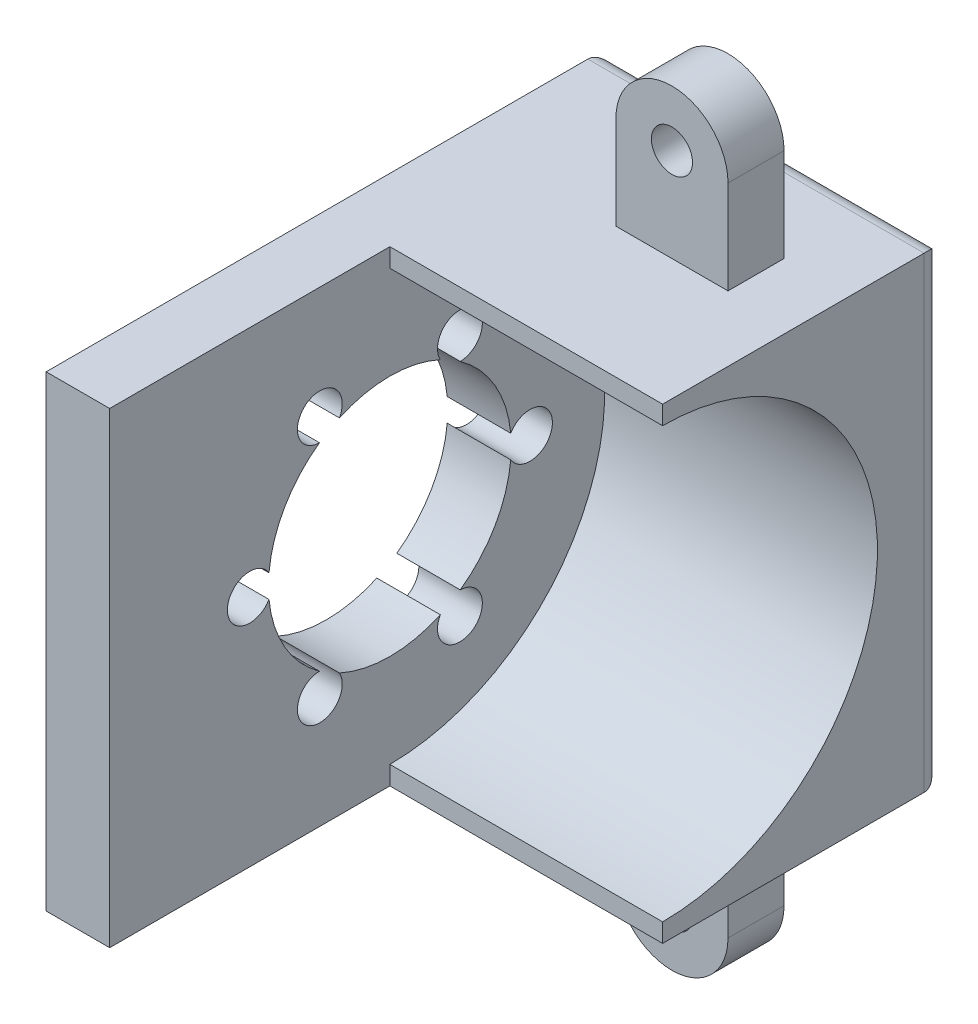
ISO-10303-21;
HEADER;
FILE_DESCRIPTION(('STEP AP214'),'2;1');
FILE_NAME('part.step','',(''),(''),'','','');
FILE_SCHEMA(('AUTOMOTIVE_DESIGN { 1 0 10303 214 1 1 1 1 }'));
ENDSEC;
DATA;
#1=APPLICATION_CONTEXT('core data for automotive mechanical design processes');
#2=APPLICATION_PROTOCOL_DEFINITION('international standard','automotive_design',2000,#1);
#3=PRODUCT_CONTEXT('',#1,'mechanical');
#4=PRODUCT('Part','Part','',(#3));
#5=PRODUCT_RELATED_PRODUCT_CATEGORY('part','',(#4));
#6=PRODUCT_DEFINITION_FORMATION('','',#4);
#7=PRODUCT_DEFINITION_CONTEXT('part definition',#1,'design');
#8=PRODUCT_DEFINITION('design','',#6,#7);
#9=PRODUCT_DEFINITION_SHAPE('','',#8);
#10=(LENGTH_UNIT() NAMED_UNIT(*) SI_UNIT(.MILLI.,.METRE.));
#11=(NAMED_UNIT(*) PLANE_ANGLE_UNIT() SI_UNIT($,.RADIAN.));
#12=(NAMED_UNIT(*) SI_UNIT($,.STERADIAN.) SOLID_ANGLE_UNIT());
#13=UNCERTAINTY_MEASURE_WITH_UNIT(LENGTH_MEASURE(1.E-05),#10,'distance_accuracy_value','');
#14=(GEOMETRIC_REPRESENTATION_CONTEXT(3) GLOBAL_UNCERTAINTY_ASSIGNED_CONTEXT((#13)) GLOBAL_UNIT_ASSIGNED_CONTEXT((#10,
#11,#12)) REPRESENTATION_CONTEXT('',''));
#15=CARTESIAN_POINT('',(0.,0.,0.));
#16=DIRECTION('',(0.,0.,1.));
#17=DIRECTION('',(1.,0.,0.));
#18=AXIS2_PLACEMENT_3D('',#15,#16,#17);
#19=CARTESIAN_POINT('',(-3.,-17.5,-7.));
#20=DIRECTION('',(-1.,0.,0.));
#21=DIRECTION('',(0.,-1.,0.));
#22=AXIS2_PLACEMENT_3D('',#19,#20,#21);
#23=PLANE('',#22);
#24=DIRECTION('',(0.,0.,-1.));
#25=VECTOR('',#24,1.);
#26=CARTESIAN_POINT('',(-3.,-12.5,-7.));
#27=LINE('',#26,#25);
#28=CARTESIAN_POINT('',(-3.,-12.5,-7.));
#29=VERTEX_POINT('',#28);
#30=CARTESIAN_POINT('',(-3.,-12.5,-10.));
#31=VERTEX_POINT('',#30);
#32=EDGE_CURVE('E540',#29,#31,#27,.T.);
#33=ORIENTED_EDGE('',*,*,#32,.T.);
#34=DIRECTION('',(0.,1.,0.));
#35=VECTOR('',#34,1.);
#36=CARTESIAN_POINT('',(-3.,-17.5,-10.));
#37=LINE('',#36,#35);
#38=CARTESIAN_POINT('',(-3.,-17.5,-10.));
#39=VERTEX_POINT('',#38);
#40=EDGE_CURVE('E518',#39,#31,#37,.T.);
#41=ORIENTED_EDGE('',*,*,#40,.F.);
#42=DIRECTION('',(0.,0.,-1.));
#43=VECTOR('',#42,1.);
#44=CARTESIAN_POINT('',(-3.,-17.5,-7.));
#45=LINE('',#44,#43);
#46=CARTESIAN_POINT('',(-3.,-17.5,-7.));
#47=VERTEX_POINT('',#46);
#48=EDGE_CURVE('E541',#47,#39,#45,.T.);
#49=ORIENTED_EDGE('',*,*,#48,.F.);
#50=DIRECTION('',(0.,1.,0.));
#51=VECTOR('',#50,1.);
#52=CARTESIAN_POINT('',(-3.,-17.5,-7.));
#53=LINE('',#52,#51);
#54=EDGE_CURVE('E528',#47,#29,#53,.T.);
#55=ORIENTED_EDGE('',*,*,#54,.T.);
#56=EDGE_LOOP('',(#33,#41,#49,#55));
#57=FACE_BOUND('',#56,.T.);
#58=ADVANCED_FACE('F93',(#57),#23,.T.);
#59=CARTESIAN_POINT('',(0.,-17.5,-7.));
#60=DIRECTION('',(0.,0.,-1.));
#61=DIRECTION('',(-1.,0.,0.));
#62=AXIS2_PLACEMENT_3D('',#59,#60,#61);
#63=CYLINDRICAL_SURFACE('',#62,3.);
#64=ORIENTED_EDGE('',*,*,#48,.T.);
#65=CARTESIAN_POINT('',(0.,-17.5,-10.));
#66=DIRECTION('',(0.,0.,-1.));
#67=DIRECTION('',(-1.,0.,0.));
#68=AXIS2_PLACEMENT_3D('',#65,#66,#67);
#69=CIRCLE('',#68,3.);
#70=CARTESIAN_POINT('',(3.,-17.5,-10.));
#71=VERTEX_POINT('',#70);
#72=EDGE_CURVE('E506',#71,#39,#69,.T.);
#73=ORIENTED_EDGE('',*,*,#72,.F.);
#74=DIRECTION('',(0.,0.,-1.));
#75=VECTOR('',#74,1.);
#76=CARTESIAN_POINT('',(3.,-17.5,-7.));
#77=LINE('',#76,#75);
#78=CARTESIAN_POINT('',(3.,-17.5,-7.));
#79=VERTEX_POINT('',#78);
#80=EDGE_CURVE('E545',#79,#71,#77,.T.);
#81=ORIENTED_EDGE('',*,*,#80,.F.);
#82=CARTESIAN_POINT('',(0.,-17.5,-7.));
#83=DIRECTION('',(0.,0.,-1.));
#84=DIRECTION('',(-1.,0.,0.));
#85=AXIS2_PLACEMENT_3D('',#82,#83,#84);
#86=CIRCLE('',#85,3.);
#87=EDGE_CURVE('E537',#79,#47,#86,.T.);
#88=ORIENTED_EDGE('',*,*,#87,.T.);
#89=EDGE_LOOP('',(#64,#73,#81,#88));
#90=FACE_BOUND('',#89,.T.);
#91=ADVANCED_FACE('F380',(#90),#63,.T.);
#92=CARTESIAN_POINT('',(3.,-17.5,-7.));
#93=DIRECTION('',(1.,0.,0.));
#94=DIRECTION('',(0.,0.,-1.));
#95=AXIS2_PLACEMENT_3D('',#92,#93,#94);
#96=PLANE('',#95);
#97=ORIENTED_EDGE('',*,*,#80,.T.);
#98=DIRECTION('',(0.,-1.,0.));
#99=VECTOR('',#98,1.);
#100=CARTESIAN_POINT('',(3.,-17.5,-10.));
#101=LINE('',#100,#99);
#102=CARTESIAN_POINT('',(3.,-12.5,-10.));
#103=VERTEX_POINT('',#102);
#104=EDGE_CURVE('E523',#103,#71,#101,.T.);
#105=ORIENTED_EDGE('',*,*,#104,.F.);
#106=DIRECTION('',(0.,0.,-1.));
#107=VECTOR('',#106,1.);
#108=CARTESIAN_POINT('',(3.,-12.5,-7.));
#109=LINE('',#108,#107);
#110=CARTESIAN_POINT('',(3.,-12.5,-7.));
#111=VERTEX_POINT('',#110);
#112=EDGE_CURVE('E548',#111,#103,#109,.T.);
#113=ORIENTED_EDGE('',*,*,#112,.F.);
#114=DIRECTION('',(0.,-1.,0.));
#115=VECTOR('',#114,1.);
#116=CARTESIAN_POINT('',(3.,-17.5,-7.));
#117=LINE('',#116,#115);
#118=EDGE_CURVE('E534',#111,#79,#117,.T.);
#119=ORIENTED_EDGE('',*,*,#118,.T.);
#120=EDGE_LOOP('',(#97,#105,#113,#119));
#121=FACE_BOUND('',#120,.T.);
#122=ADVANCED_FACE('F386',(#121),#96,.T.);
#123=CARTESIAN_POINT('',(0.,-17.5,-7.));
#124=DIRECTION('',(0.,0.,-1.));
#125=DIRECTION('',(-1.,0.,0.));
#126=AXIS2_PLACEMENT_3D('',#123,#124,#125);
#127=CYLINDRICAL_SURFACE('',#126,1.1);
#128=CARTESIAN_POINT('',(0.,-17.5,-7.));
#129=DIRECTION('',(0.,0.,-1.));
#130=DIRECTION('',(-1.,0.,0.));
#131=AXIS2_PLACEMENT_3D('',#128,#129,#130);
#132=CIRCLE('',#131,1.1);
#133=CARTESIAN_POINT('',(-1.1,-17.5,-7.));
#134=VERTEX_POINT('',#133);
#135=EDGE_CURVE('E515',#134,#134,#132,.T.);
#136=ORIENTED_EDGE('',*,*,#135,.F.);
#137=EDGE_LOOP('',(#136));
#138=FACE_BOUND('',#137,.T.);
#139=CARTESIAN_POINT('',(0.,-17.5,-10.));
#140=DIRECTION('',(0.,0.,-1.));
#141=DIRECTION('',(-1.,0.,0.));
#142=AXIS2_PLACEMENT_3D('',#139,#140,#141);
#143=CIRCLE('',#142,1.1);
#144=CARTESIAN_POINT('',(-1.1,-17.5,-10.));
#145=VERTEX_POINT('',#144);
#146=EDGE_CURVE('E359',#145,#145,#143,.T.);
#147=ORIENTED_EDGE('',*,*,#146,.T.);
#148=EDGE_LOOP('',(#147));
#149=FACE_BOUND('',#148,.T.);
#150=ADVANCED_FACE('F752',(#138,#149),#127,.F.);
#151=CARTESIAN_POINT('',(0.,12.5,-15.));
#152=DIRECTION('',(0.,-1.,0.));
#153=DIRECTION('',(0.,0.,-1.));
#154=AXIS2_PLACEMENT_3D('',#151,#152,#153);
#155=PLANE('',#154);
#156=DIRECTION('',(0.,0.,-1.));
#157=VECTOR('',#156,1.);
#158=CARTESIAN_POINT('',(6.5,12.5,-15.));
#159=LINE('',#158,#157);
#160=CARTESIAN_POINT('',(6.5,12.5,0.));
#161=VERTEX_POINT('',#160);
#162=CARTESIAN_POINT('',(6.5,12.5,-14.));
#163=VERTEX_POINT('',#162);
#164=EDGE_CURVE('E360',#161,#163,#159,.T.);
#165=ORIENTED_EDGE('',*,*,#164,.T.);
#166=DIRECTION('',(1.,0.,0.));
#167=VECTOR('',#166,1.);
#168=CARTESIAN_POINT('',(0.,12.5,-14.));
#169=LINE('',#168,#167);
#170=CARTESIAN_POINT('',(-11.5,12.5,-14.));
#171=VERTEX_POINT('',#170);
#172=EDGE_CURVE('E12',#163,#171,#169,.F.);
#173=ORIENTED_EDGE('',*,*,#172,.T.);
#174=DIRECTION('',(0.,0.,1.));
#175=VECTOR('',#174,1.);
#176=CARTESIAN_POINT('',(-11.5,12.5,-15.));
#177=LINE('',#176,#175);
#178=CARTESIAN_POINT('',(-11.5,12.5,15.));
#179=VERTEX_POINT('',#178);
#180=EDGE_CURVE('E485',#171,#179,#177,.T.);
#181=ORIENTED_EDGE('',*,*,#180,.T.);
#182=DIRECTION('',(-1.,0.,0.));
#183=VECTOR('',#182,1.);
#184=CARTESIAN_POINT('',(-11.5,12.5,15.));
#185=LINE('',#184,#183);
#186=CARTESIAN_POINT('',(-8.10000000000001,12.5,15.));
#187=VERTEX_POINT('',#186);
#188=EDGE_CURVE('E473',#187,#179,#185,.T.);
#189=ORIENTED_EDGE('',*,*,#188,.F.);
#190=DIRECTION('',(0.,0.,-1.));
#191=VECTOR('',#190,1.);
#192=CARTESIAN_POINT('',(-8.10000000000001,12.5,15.));
#193=LINE('',#192,#191);
#194=CARTESIAN_POINT('',(-8.1,12.5,0.));
#195=VERTEX_POINT('',#194);
#196=EDGE_CURVE('E480',#187,#195,#193,.T.);
#197=ORIENTED_EDGE('',*,*,#196,.T.);
#198=DIRECTION('',(1.,0.,0.));
#199=VECTOR('',#198,1.);
#200=CARTESIAN_POINT('',(0.,12.5,0.));
#201=LINE('',#200,#199);
#202=EDGE_CURVE('E465',#195,#161,#201,.T.);
#203=ORIENTED_EDGE('',*,*,#202,.T.);
#204=EDGE_LOOP('',(#165,#173,#181,#189,#197,#203));
#205=FACE_BOUND('',#204,.T.);
#206=DIRECTION('',(0.,0.,-1.));
#207=VECTOR('',#206,1.);
#208=CARTESIAN_POINT('',(3.,12.5,-7.));
#209=LINE('',#208,#207);
#210=CARTESIAN_POINT('',(3.,12.5,-7.));
#211=VERTEX_POINT('',#210);
#212=CARTESIAN_POINT('',(3.,12.5,-10.));
#213=VERTEX_POINT('',#212);
#214=EDGE_CURVE('E574',#211,#213,#209,.T.);
#215=ORIENTED_EDGE('',*,*,#214,.F.);
#216=DIRECTION('',(-1.,0.,0.));
#217=VECTOR('',#216,1.);
#218=CARTESIAN_POINT('',(3.,12.5,-7.));
#219=LINE('',#218,#217);
#220=CARTESIAN_POINT('',(-3.,12.5,-7.));
#221=VERTEX_POINT('',#220);
#222=EDGE_CURVE('E560',#211,#221,#219,.T.);
#223=ORIENTED_EDGE('',*,*,#222,.T.);
#224=DIRECTION('',(0.,0.,-1.));
#225=VECTOR('',#224,1.);
#226=CARTESIAN_POINT('',(-3.,12.5,-7.));
#227=LINE('',#226,#225);
#228=CARTESIAN_POINT('',(-3.,12.5,-10.));
#229=VERTEX_POINT('',#228);
#230=EDGE_CURVE('E571',#221,#229,#227,.T.);
#231=ORIENTED_EDGE('',*,*,#230,.T.);
#232=DIRECTION('',(-1.,0.,0.));
#233=VECTOR('',#232,1.);
#234=CARTESIAN_POINT('',(3.,12.5,-10.));
#235=LINE('',#234,#233);
#236=EDGE_CURVE('E511',#213,#229,#235,.T.);
#237=ORIENTED_EDGE('',*,*,#236,.F.);
#238=EDGE_LOOP('',(#215,#223,#231,#237));
#239=FACE_BOUND('',#238,.T.);
#240=ADVANCED_FACE('F488',(#205,#239),#155,.F.);
#241=CARTESIAN_POINT('',(0.,0.,0.));
#242=DIRECTION('',(0.,0.,1.));
#243=DIRECTION('',(1.,0.,0.));
#244=AXIS2_PLACEMENT_3D('',#241,#242,#243);
#245=PLANE('',#244);
#246=DIRECTION('',(0.,-1.,0.));
#247=VECTOR('',#246,1.);
#248=CARTESIAN_POINT('',(6.5,0.,0.));
#249=LINE('',#248,#247);
#250=CARTESIAN_POINT('',(6.5,11.5,0.));
#251=VERTEX_POINT('',#250);
#252=EDGE_CURVE('E296',#161,#251,#249,.T.);
#253=ORIENTED_EDGE('',*,*,#252,.F.);
#254=ORIENTED_EDGE('',*,*,#202,.F.);
#255=DIRECTION('',(0.,1.,0.));
#256=VECTOR('',#255,1.);
#257=CARTESIAN_POINT('',(-8.10000000000001,12.5,0.));
#258=LINE('',#257,#256);
#259=CARTESIAN_POINT('',(-8.10000000000001,11.5,0.));
#260=VERTEX_POINT('',#259);
#261=EDGE_CURVE('E461',#260,#195,#258,.T.);
#262=ORIENTED_EDGE('',*,*,#261,.F.);
#263=DIRECTION('',(1.,0.,0.));
#264=VECTOR('',#263,1.);
#265=CARTESIAN_POINT('',(11.5,11.5,0.));
#266=LINE('',#265,#264);
#267=EDGE_CURVE('E314',#260,#251,#266,.T.);
#268=ORIENTED_EDGE('',*,*,#267,.T.);
#269=EDGE_LOOP('',(#253,#254,#262,#268));
#270=FACE_BOUND('',#269,.T.);
#271=ADVANCED_FACE('F469',(#270),#245,.T.);
#272=DIRECTION('',(0.,-1.,0.));
#273=VECTOR('',#272,1.);
#274=CARTESIAN_POINT('',(6.5,0.,0.));
#275=LINE('',#274,#273);
#276=CARTESIAN_POINT('',(6.5,-11.5,0.));
#277=VERTEX_POINT('',#276);
#278=CARTESIAN_POINT('',(6.5,-12.5,0.));
#279=VERTEX_POINT('',#278);
#280=EDGE_CURVE('E293',#277,#279,#275,.T.);
#281=ORIENTED_EDGE('',*,*,#280,.F.);
#282=DIRECTION('',(1.,0.,0.));
#283=VECTOR('',#282,1.);
#284=CARTESIAN_POINT('',(11.5,-11.5,0.));
#285=LINE('',#284,#283);
#286=CARTESIAN_POINT('',(-8.1,-11.5,0.));
#287=VERTEX_POINT('',#286);
#288=EDGE_CURVE('E301',#277,#287,#285,.F.);
#289=ORIENTED_EDGE('',*,*,#288,.T.);
#290=CARTESIAN_POINT('',(-8.1,-12.5,0.));
#291=VERTEX_POINT('',#290);
#292=EDGE_CURVE('E464',#291,#287,#258,.T.);
#293=ORIENTED_EDGE('',*,*,#292,.F.);
#294=DIRECTION('',(1.,0.,0.));
#295=VECTOR('',#294,1.);
#296=CARTESIAN_POINT('',(0.,-12.5,0.));
#297=LINE('',#296,#295);
#298=EDGE_CURVE('E308',#291,#279,#297,.T.);
#299=ORIENTED_EDGE('',*,*,#298,.T.);
#300=EDGE_LOOP('',(#281,#289,#293,#299));
#301=FACE_BOUND('',#300,.T.);
#302=ADVANCED_FACE('F305',(#301),#245,.T.);
#303=CARTESIAN_POINT('',(0.,-12.5,-15.));
#304=DIRECTION('',(0.,-1.,0.));
#305=DIRECTION('',(0.,0.,-1.));
#306=AXIS2_PLACEMENT_3D('',#303,#304,#305);
#307=PLANE('',#306);
#308=DIRECTION('',(0.,0.,1.));
#309=VECTOR('',#308,1.);
#310=CARTESIAN_POINT('',(-11.5,-12.5,-15.));
#311=LINE('',#310,#309);
#312=CARTESIAN_POINT('',(-11.5,-12.5,-14.));
#313=VERTEX_POINT('',#312);
#314=CARTESIAN_POINT('',(-11.5,-12.5,15.));
#315=VERTEX_POINT('',#314);
#316=EDGE_CURVE('E316',#313,#315,#311,.T.);
#317=ORIENTED_EDGE('',*,*,#316,.F.);
#318=DIRECTION('',(1.,0.,0.));
#319=VECTOR('',#318,1.);
#320=CARTESIAN_POINT('',(6.5,-12.5,-14.));
#321=LINE('',#320,#319);
#322=CARTESIAN_POINT('',(6.5,-12.5,-14.));
#323=VERTEX_POINT('',#322);
#324=EDGE_CURVE('E331',#313,#323,#321,.T.);
#325=ORIENTED_EDGE('',*,*,#324,.T.);
#326=DIRECTION('',(0.,0.,-1.));
#327=VECTOR('',#326,1.);
#328=CARTESIAN_POINT('',(6.5,-12.5,-15.));
#329=LINE('',#328,#327);
#330=EDGE_CURVE('E356',#279,#323,#329,.T.);
#331=ORIENTED_EDGE('',*,*,#330,.F.);
#332=ORIENTED_EDGE('',*,*,#298,.F.);
#333=DIRECTION('',(0.,0.,-1.));
#334=VECTOR('',#333,1.);
#335=CARTESIAN_POINT('',(-8.1,-12.5,15.));
#336=LINE('',#335,#334);
#337=CARTESIAN_POINT('',(-8.1,-12.5,15.));
#338=VERTEX_POINT('',#337);
#339=EDGE_CURVE('E466',#338,#291,#336,.T.);
#340=ORIENTED_EDGE('',*,*,#339,.F.);
#341=DIRECTION('',(1.,0.,0.));
#342=VECTOR('',#341,1.);
#343=CARTESIAN_POINT('',(-8.1,-12.5,15.));
#344=LINE('',#343,#342);
#345=EDGE_CURVE('E493',#315,#338,#344,.T.);
#346=ORIENTED_EDGE('',*,*,#345,.F.);
#347=EDGE_LOOP('',(#317,#325,#331,#332,#340,#346));
#348=FACE_BOUND('',#347,.T.);
#349=ORIENTED_EDGE('',*,*,#32,.F.);
#350=DIRECTION('',(1.,0.,0.));
#351=VECTOR('',#350,1.);
#352=CARTESIAN_POINT('',(3.,-12.5,-7.));
#353=LINE('',#352,#351);
#354=EDGE_CURVE('E531',#29,#111,#353,.T.);
#355=ORIENTED_EDGE('',*,*,#354,.T.);
#356=ORIENTED_EDGE('',*,*,#112,.T.);
#357=DIRECTION('',(1.,0.,0.));
#358=VECTOR('',#357,1.);
#359=CARTESIAN_POINT('',(3.,-12.5,-10.));
#360=LINE('',#359,#358);
#361=EDGE_CURVE('E521',#31,#103,#360,.T.);
#362=ORIENTED_EDGE('',*,*,#361,.F.);
#363=EDGE_LOOP('',(#349,#355,#356,#362));
#364=FACE_BOUND('',#363,.T.);
#365=ADVANCED_FACE('F354',(#348,#364),#307,.T.);
#366=CARTESIAN_POINT('',(-11.5,0.,-15.));
#367=DIRECTION('',(-1.,0.,0.));
#368=DIRECTION('',(0.,0.,1.));
#369=AXIS2_PLACEMENT_3D('',#366,#367,#368);
#370=PLANE('',#369);
#371=CARTESIAN_POINT('',(-11.5,0.,0.));
#372=DIRECTION('',(-1.,0.,0.));
#373=DIRECTION('',(0.,0.,1.));
#374=AXIS2_PLACEMENT_3D('',#371,#372,#373);
#375=CIRCLE('',#374,6.5);
#376=CARTESIAN_POINT('',(-11.5,0.616824844578213,6.47066666666666));
#377=VERTEX_POINT('',#376);
#378=CARTESIAN_POINT('',(-11.5,5.29534929046546,3.76951931842337));
#379=VERTEX_POINT('',#378);
#380=EDGE_CURVE('E631',#377,#379,#375,.T.);
#381=ORIENTED_EDGE('',*,*,#380,.F.);
#382=CARTESIAN_POINT('',(-11.5,0.,7.5));
#383=DIRECTION('',(-1.,0.,0.));
#384=DIRECTION('',(0.,0.,1.));
#385=AXIS2_PLACEMENT_3D('',#382,#383,#384);
#386=CIRCLE('',#385,1.2);
#387=CARTESIAN_POINT('',(-11.5,-0.616824844578123,6.47066666666667));
#388=VERTEX_POINT('',#387);
#389=EDGE_CURVE('E637',#388,#377,#386,.T.);
#390=ORIENTED_EDGE('',*,*,#389,.F.);
#391=CARTESIAN_POINT('',(-11.5,0.,0.));
#392=DIRECTION('',(-1.,0.,0.));
#393=DIRECTION('',(0.,0.,1.));
#394=AXIS2_PLACEMENT_3D('',#391,#392,#393);
#395=CIRCLE('',#394,6.5);
#396=CARTESIAN_POINT('',(-11.5,-5.29534929046541,3.76951931842344));
#397=VERTEX_POINT('',#396);
#398=EDGE_CURVE('E633',#397,#388,#395,.T.);
#399=ORIENTED_EDGE('',*,*,#398,.F.);
#400=CARTESIAN_POINT('',(-11.5,-6.49519052838327,3.75000000000003));
#401=DIRECTION('',(-1.,0.,0.));
#402=DIRECTION('',(0.,0.,1.));
#403=AXIS2_PLACEMENT_3D('',#400,#401,#402);
#404=CIRCLE('',#403,1.2);
#405=CARTESIAN_POINT('',(-11.5,-5.91217413504358,2.70114734824327));
#406=VERTEX_POINT('',#405);
#407=EDGE_CURVE('E474',#406,#397,#404,.T.);
#408=ORIENTED_EDGE('',*,*,#407,.F.);
#409=CARTESIAN_POINT('',(-11.5,0.,0.));
#410=DIRECTION('',(-1.,0.,0.));
#411=DIRECTION('',(0.,0.,1.));
#412=AXIS2_PLACEMENT_3D('',#409,#410,#411);
#413=CIRCLE('',#412,6.5);
#414=CARTESIAN_POINT('',(-11.5,-5.91217413504364,-2.70114734824315));
#415=VERTEX_POINT('',#414);
#416=EDGE_CURVE('E635',#415,#406,#413,.T.);
#417=ORIENTED_EDGE('',*,*,#416,.F.);
#418=CARTESIAN_POINT('',(-11.5,-6.49519052838335,-3.74999999999989));
#419=DIRECTION('',(-1.,0.,0.));
#420=DIRECTION('',(0.,0.,1.));
#421=AXIS2_PLACEMENT_3D('',#418,#419,#420);
#422=CIRCLE('',#421,1.2);
#423=CARTESIAN_POINT('',(-11.5,-5.29534929046548,-3.76951931842333));
#424=VERTEX_POINT('',#423);
#425=EDGE_CURVE('E641',#424,#415,#422,.T.);
#426=ORIENTED_EDGE('',*,*,#425,.F.);
#427=CARTESIAN_POINT('',(-11.5,0.,0.));
#428=DIRECTION('',(-1.,0.,0.));
#429=DIRECTION('',(0.,0.,1.));
#430=AXIS2_PLACEMENT_3D('',#427,#428,#429);
#431=CIRCLE('',#430,6.5);
#432=CARTESIAN_POINT('',(-11.5,-0.616824844578176,-6.47066666666667));
#433=VERTEX_POINT('',#432);
#434=EDGE_CURVE('E586',#433,#424,#431,.T.);
#435=ORIENTED_EDGE('',*,*,#434,.F.);
#436=CARTESIAN_POINT('',(-11.5,0.,-7.5));
#437=DIRECTION('',(-1.,0.,0.));
#438=DIRECTION('',(0.,0.,1.));
#439=AXIS2_PLACEMENT_3D('',#436,#437,#438);
#440=CIRCLE('',#439,1.2);
#441=CARTESIAN_POINT('',(-11.5,0.616824844578176,-6.47066666666667));
#442=VERTEX_POINT('',#441);
#443=EDGE_CURVE('E643',#442,#433,#440,.T.);
#444=ORIENTED_EDGE('',*,*,#443,.F.);
#445=CARTESIAN_POINT('',(-11.5,0.,0.));
#446=DIRECTION('',(-1.,0.,0.));
#447=DIRECTION('',(0.,0.,1.));
#448=AXIS2_PLACEMENT_3D('',#445,#446,#447);
#449=CIRCLE('',#448,6.5);
#450=CARTESIAN_POINT('',(-11.5,5.29534929046538,-3.76951931842348));
#451=VERTEX_POINT('',#450);
#452=EDGE_CURVE('E627',#451,#442,#449,.T.);
#453=ORIENTED_EDGE('',*,*,#452,.F.);
#454=CARTESIAN_POINT('',(-11.5,6.49519052838325,-3.75000000000008));
#455=DIRECTION('',(-1.,0.,0.));
#456=DIRECTION('',(0.,0.,1.));
#457=AXIS2_PLACEMENT_3D('',#454,#455,#456);
#458=CIRCLE('',#457,1.2);
#459=CARTESIAN_POINT('',(-11.5,5.91217413504356,-2.70114734824332));
#460=VERTEX_POINT('',#459);
#461=EDGE_CURVE('E639',#460,#451,#458,.T.);
#462=ORIENTED_EDGE('',*,*,#461,.F.);
#463=CARTESIAN_POINT('',(-11.5,0.,0.));
#464=DIRECTION('',(-1.,0.,0.));
#465=DIRECTION('',(0.,0.,1.));
#466=AXIS2_PLACEMENT_3D('',#463,#464,#465);
#467=CIRCLE('',#466,6.5);
#468=CARTESIAN_POINT('',(-11.5,5.91217413504362,2.7011473482432));
#469=VERTEX_POINT('',#468);
#470=EDGE_CURVE('E629',#469,#460,#467,.T.);
#471=ORIENTED_EDGE('',*,*,#470,.F.);
#472=CARTESIAN_POINT('',(-11.5,6.49519052838333,3.74999999999994));
#473=DIRECTION('',(-1.,0.,0.));
#474=DIRECTION('',(0.,0.,1.));
#475=AXIS2_PLACEMENT_3D('',#472,#473,#474);
#476=CIRCLE('',#475,1.2);
#477=EDGE_CURVE('E471',#379,#469,#476,.T.);
#478=ORIENTED_EDGE('',*,*,#477,.F.);
#479=EDGE_LOOP('',(#381,#390,#399,#408,#417,#426,#435,#444,#453,#462,#471,#478));
#480=FACE_BOUND('',#479,.T.);
#481=ORIENTED_EDGE('',*,*,#180,.F.);
#482=DIRECTION('',(0.,-1.,0.));
#483=VECTOR('',#482,1.);
#484=CARTESIAN_POINT('',(-11.5,-12.5,-14.));
#485=LINE('',#484,#483);
#486=EDGE_CURVE('E102',#171,#313,#485,.T.);
#487=ORIENTED_EDGE('',*,*,#486,.T.);
#488=ORIENTED_EDGE('',*,*,#316,.T.);
#489=DIRECTION('',(0.,-1.,0.));
#490=VECTOR('',#489,1.);
#491=CARTESIAN_POINT('',(-11.5,-12.5,15.));
#492=LINE('',#491,#490);
#493=EDGE_CURVE('E492',#179,#315,#492,.T.);
#494=ORIENTED_EDGE('',*,*,#493,.F.);
#495=EDGE_LOOP('',(#481,#487,#488,#494));
#496=FACE_BOUND('',#495,.T.);
#497=ADVANCED_FACE('F368',(#480,#496),#370,.T.);
#498=CARTESIAN_POINT('',(0.,0.,-15.));
#499=DIRECTION('',(0.,0.,1.));
#500=DIRECTION('',(1.,0.,0.));
#501=AXIS2_PLACEMENT_3D('',#498,#499,#500);
#502=PLANE('',#501);
#503=DIRECTION('',(1.,0.,0.));
#504=VECTOR('',#503,1.);
#505=CARTESIAN_POINT('',(0.,11.5,-15.));
#506=LINE('',#505,#504);
#507=CARTESIAN_POINT('',(-10.5,11.5,-15.));
#508=VERTEX_POINT('',#507);
#509=CARTESIAN_POINT('',(5.5,11.5,-15.));
#510=VERTEX_POINT('',#509);
#511=EDGE_CURVE('E300',#508,#510,#506,.T.);
#512=ORIENTED_EDGE('',*,*,#511,.T.);
#513=DIRECTION('',(0.,-1.,0.));
#514=VECTOR('',#513,1.);
#515=CARTESIAN_POINT('',(5.5,0.,-15.));
#516=LINE('',#515,#514);
#517=CARTESIAN_POINT('',(5.5,-11.5,-15.));
#518=VERTEX_POINT('',#517);
#519=EDGE_CURVE('E325',#510,#518,#516,.T.);
#520=ORIENTED_EDGE('',*,*,#519,.T.);
#521=DIRECTION('',(1.,0.,0.));
#522=VECTOR('',#521,1.);
#523=CARTESIAN_POINT('',(-11.5,-11.5,-15.));
#524=LINE('',#523,#522);
#525=CARTESIAN_POINT('',(-10.5,-11.5,-15.));
#526=VERTEX_POINT('',#525);
#527=EDGE_CURVE('E323',#518,#526,#524,.F.);
#528=ORIENTED_EDGE('',*,*,#527,.T.);
#529=DIRECTION('',(0.,-1.,0.));
#530=VECTOR('',#529,1.);
#531=CARTESIAN_POINT('',(-10.5,12.5,-15.));
#532=LINE('',#531,#530);
#533=EDGE_CURVE('E321',#526,#508,#532,.F.);
#534=ORIENTED_EDGE('',*,*,#533,.T.);
#535=EDGE_LOOP('',(#512,#520,#528,#534));
#536=FACE_BOUND('',#535,.T.);
#537=ADVANCED_FACE('F366',(#536),#502,.F.);
#538=CARTESIAN_POINT('',(11.5,0.,0.));
#539=DIRECTION('',(1.,0.,0.));
#540=DIRECTION('',(0.,0.,-1.));
#541=AXIS2_PLACEMENT_3D('',#538,#539,#540);
#542=CYLINDRICAL_SURFACE('',#541,11.5);
#543=CARTESIAN_POINT('',(6.5,0.,0.));
#544=DIRECTION('',(-1.,0.,0.));
#545=DIRECTION('',(0.,0.,1.));
#546=AXIS2_PLACEMENT_3D('',#543,#544,#545);
#547=CIRCLE('',#546,11.5);
#548=EDGE_CURVE('E289',#251,#277,#547,.T.);
#549=ORIENTED_EDGE('',*,*,#548,.F.);
#550=ORIENTED_EDGE('',*,*,#267,.F.);
#551=CARTESIAN_POINT('',(-8.1,0.,0.));
#552=DIRECTION('',(1.,0.,0.));
#553=DIRECTION('',(0.,0.,-1.));
#554=AXIS2_PLACEMENT_3D('',#551,#552,#553);
#555=CIRCLE('',#554,11.5);
#556=EDGE_CURVE('E312',#287,#260,#555,.T.);
#557=ORIENTED_EDGE('',*,*,#556,.F.);
#558=ORIENTED_EDGE('',*,*,#288,.F.);
#559=EDGE_LOOP('',(#549,#550,#557,#558));
#560=FACE_BOUND('',#559,.T.);
#561=ADVANCED_FACE('F310',(#560),#542,.F.);
#562=CARTESIAN_POINT('',(-8.1,-11.5,0.));
#563=DIRECTION('',(1.,0.,0.));
#564=DIRECTION('',(0.,0.,-1.));
#565=AXIS2_PLACEMENT_3D('',#562,#563,#564);
#566=PLANE('',#565);
#567=CARTESIAN_POINT('',(-8.1,0.,0.));
#568=DIRECTION('',(1.,0.,0.));
#569=DIRECTION('',(0.,0.,-1.));
#570=AXIS2_PLACEMENT_3D('',#567,#568,#569);
#571=CIRCLE('',#570,6.5);
#572=CARTESIAN_POINT('',(-8.1,5.29534929046546,3.76951931842337));
#573=VERTEX_POINT('',#572);
#574=CARTESIAN_POINT('',(-8.1,0.616824844578213,6.47066666666666));
#575=VERTEX_POINT('',#574);
#576=EDGE_CURVE('E457',#573,#575,#571,.T.);
#577=ORIENTED_EDGE('',*,*,#576,.F.);
#578=CARTESIAN_POINT('',(-8.1,6.49519052838333,3.74999999999994));
#579=DIRECTION('',(1.,0.,0.));
#580=DIRECTION('',(0.,0.,-1.));
#581=AXIS2_PLACEMENT_3D('',#578,#579,#580);
#582=CIRCLE('',#581,1.2);
#583=CARTESIAN_POINT('',(-8.1,5.91217413504362,2.7011473482432));
#584=VERTEX_POINT('',#583);
#585=EDGE_CURVE('E579',#584,#573,#582,.T.);
#586=ORIENTED_EDGE('',*,*,#585,.F.);
#587=CARTESIAN_POINT('',(-8.1,5.91217413504356,-2.70114734824332));
#588=VERTEX_POINT('',#587);
#589=EDGE_CURVE('E663',#588,#584,#571,.T.);
#590=ORIENTED_EDGE('',*,*,#589,.F.);
#591=CARTESIAN_POINT('',(-8.1,6.49519052838325,-3.75000000000008));
#592=DIRECTION('',(1.,0.,0.));
#593=DIRECTION('',(0.,0.,-1.));
#594=AXIS2_PLACEMENT_3D('',#591,#592,#593);
#595=CIRCLE('',#594,1.2);
#596=CARTESIAN_POINT('',(-8.1,5.29534929046538,-3.76951931842348));
#597=VERTEX_POINT('',#596);
#598=EDGE_CURVE('E595',#597,#588,#595,.T.);
#599=ORIENTED_EDGE('',*,*,#598,.F.);
#600=CARTESIAN_POINT('',(-8.1,0.616824844578176,-6.47066666666667));
#601=VERTEX_POINT('',#600);
#602=EDGE_CURVE('E625',#601,#597,#571,.T.);
#603=ORIENTED_EDGE('',*,*,#602,.F.);
#604=CARTESIAN_POINT('',(-8.1,0.,-7.5));
#605=DIRECTION('',(1.,0.,0.));
#606=DIRECTION('',(0.,0.,-1.));
#607=AXIS2_PLACEMENT_3D('',#604,#605,#606);
#608=CIRCLE('',#607,1.2);
#609=CARTESIAN_POINT('',(-8.1,-0.616824844578176,-6.47066666666667));
#610=VERTEX_POINT('',#609);
#611=EDGE_CURVE('E602',#610,#601,#608,.T.);
#612=ORIENTED_EDGE('',*,*,#611,.F.);
#613=CARTESIAN_POINT('',(-8.1,-5.29534929046548,-3.76951931842333));
#614=VERTEX_POINT('',#613);
#615=EDGE_CURVE('E619',#614,#610,#571,.T.);
#616=ORIENTED_EDGE('',*,*,#615,.F.);
#617=CARTESIAN_POINT('',(-8.1,-6.49519052838335,-3.74999999999989));
#618=DIRECTION('',(1.,0.,0.));
#619=DIRECTION('',(0.,0.,-1.));
#620=AXIS2_PLACEMENT_3D('',#617,#618,#619);
#621=CIRCLE('',#620,1.2);
#622=CARTESIAN_POINT('',(-8.1,-5.91217413504364,-2.70114734824315));
#623=VERTEX_POINT('',#622);
#624=EDGE_CURVE('E616',#623,#614,#621,.T.);
#625=ORIENTED_EDGE('',*,*,#624,.F.);
#626=CARTESIAN_POINT('',(-8.1,-5.91217413504358,2.70114734824327));
#627=VERTEX_POINT('',#626);
#628=EDGE_CURVE('E570',#627,#623,#571,.T.);
#629=ORIENTED_EDGE('',*,*,#628,.F.);
#630=CARTESIAN_POINT('',(-8.1,-6.49519052838327,3.75000000000003));
#631=DIRECTION('',(1.,0.,0.));
#632=DIRECTION('',(0.,0.,-1.));
#633=AXIS2_PLACEMENT_3D('',#630,#631,#632);
#634=CIRCLE('',#633,1.2);
#635=CARTESIAN_POINT('',(-8.1,-5.29534929046541,3.76951931842344));
#636=VERTEX_POINT('',#635);
#637=EDGE_CURVE('E609',#636,#627,#634,.T.);
#638=ORIENTED_EDGE('',*,*,#637,.F.);
#639=CARTESIAN_POINT('',(-8.1,-0.616824844578123,6.47066666666667));
#640=VERTEX_POINT('',#639);
#641=EDGE_CURVE('E654',#640,#636,#571,.T.);
#642=ORIENTED_EDGE('',*,*,#641,.F.);
#643=CARTESIAN_POINT('',(-8.1,0.,7.5));
#644=DIRECTION('',(1.,0.,0.));
#645=DIRECTION('',(0.,0.,-1.));
#646=AXIS2_PLACEMENT_3D('',#643,#644,#645);
#647=CIRCLE('',#646,1.2);
#648=EDGE_CURVE('E588',#575,#640,#647,.T.);
#649=ORIENTED_EDGE('',*,*,#648,.F.);
#650=EDGE_LOOP('',(#577,#586,#590,#599,#603,#612,#616,#625,#629,#638,#642,#649));
#651=FACE_BOUND('',#650,.T.);
#652=ORIENTED_EDGE('',*,*,#556,.T.);
#653=ORIENTED_EDGE('',*,*,#261,.T.);
#654=ORIENTED_EDGE('',*,*,#196,.F.);
#655=DIRECTION('',(0.,1.,0.));
#656=VECTOR('',#655,1.);
#657=CARTESIAN_POINT('',(-8.10000000000001,12.5,15.));
#658=LINE('',#657,#656);
#659=EDGE_CURVE('E478',#338,#187,#658,.T.);
#660=ORIENTED_EDGE('',*,*,#659,.F.);
#661=ORIENTED_EDGE('',*,*,#339,.T.);
#662=ORIENTED_EDGE('',*,*,#292,.T.);
#663=EDGE_LOOP('',(#652,#653,#654,#660,#661,#662));
#664=FACE_BOUND('',#663,.T.);
#665=ADVANCED_FACE('F374',(#651,#664),#566,.T.);
#666=CARTESIAN_POINT('',(0.,0.,15.));
#667=DIRECTION('',(0.,0.,-1.));
#668=DIRECTION('',(-1.,0.,0.));
#669=AXIS2_PLACEMENT_3D('',#666,#667,#668);
#670=PLANE('',#669);
#671=ORIENTED_EDGE('',*,*,#188,.T.);
#672=ORIENTED_EDGE('',*,*,#493,.T.);
#673=ORIENTED_EDGE('',*,*,#345,.T.);
#674=ORIENTED_EDGE('',*,*,#659,.T.);
#675=EDGE_LOOP('',(#671,#672,#673,#674));
#676=FACE_BOUND('',#675,.T.);
#677=ADVANCED_FACE('F418',(#676),#670,.F.);
#678=CARTESIAN_POINT('',(-12.1,6.49519052838333,3.74999999999994));
#679=DIRECTION('',(1.,0.,0.));
#680=DIRECTION('',(0.,0.,-1.));
#681=AXIS2_PLACEMENT_3D('',#678,#679,#680);
#682=CYLINDRICAL_SURFACE('',#681,1.2);
#683=ORIENTED_EDGE('',*,*,#477,.T.);
#684=DIRECTION('',(1.,0.,0.));
#685=VECTOR('',#684,1.);
#686=CARTESIAN_POINT('',(-12.1,5.91217413504362,2.7011473482432));
#687=LINE('',#686,#685);
#688=EDGE_CURVE('E582',#469,#584,#687,.T.);
#689=ORIENTED_EDGE('',*,*,#688,.T.);
#690=ORIENTED_EDGE('',*,*,#585,.T.);
#691=DIRECTION('',(1.,0.,0.));
#692=VECTOR('',#691,1.);
#693=CARTESIAN_POINT('',(-12.1,5.29534929046546,3.76951931842337));
#694=LINE('',#693,#692);
#695=EDGE_CURVE('E584',#379,#573,#694,.T.);
#696=ORIENTED_EDGE('',*,*,#695,.F.);
#697=EDGE_LOOP('',(#683,#689,#690,#696));
#698=FACE_BOUND('',#697,.T.);
#699=ADVANCED_FACE('F414',(#698),#682,.F.);
#700=CARTESIAN_POINT('',(-12.1,-6.49519052838327,3.75000000000003));
#701=DIRECTION('',(1.,0.,0.));
#702=DIRECTION('',(0.,0.,-1.));
#703=AXIS2_PLACEMENT_3D('',#700,#701,#702);
#704=CYLINDRICAL_SURFACE('',#703,1.2);
#705=ORIENTED_EDGE('',*,*,#407,.T.);
#706=DIRECTION('',(1.,0.,0.));
#707=VECTOR('',#706,1.);
#708=CARTESIAN_POINT('',(-12.1,-5.29534929046541,3.76951931842344));
#709=LINE('',#708,#707);
#710=EDGE_CURVE('E612',#397,#636,#709,.T.);
#711=ORIENTED_EDGE('',*,*,#710,.T.);
#712=ORIENTED_EDGE('',*,*,#637,.T.);
#713=DIRECTION('',(1.,0.,0.));
#714=VECTOR('',#713,1.);
#715=CARTESIAN_POINT('',(-12.1,-5.91217413504358,2.70114734824327));
#716=LINE('',#715,#714);
#717=EDGE_CURVE('E606',#406,#627,#716,.T.);
#718=ORIENTED_EDGE('',*,*,#717,.F.);
#719=EDGE_LOOP('',(#705,#711,#712,#718));
#720=FACE_BOUND('',#719,.T.);
#721=ADVANCED_FACE('F417',(#720),#704,.F.);
#722=CARTESIAN_POINT('',(-12.1,0.,-7.5));
#723=DIRECTION('',(1.,0.,0.));
#724=DIRECTION('',(0.,0.,-1.));
#725=AXIS2_PLACEMENT_3D('',#722,#723,#724);
#726=CYLINDRICAL_SURFACE('',#725,1.2);
#727=ORIENTED_EDGE('',*,*,#443,.T.);
#728=DIRECTION('',(1.,0.,0.));
#729=VECTOR('',#728,1.);
#730=CARTESIAN_POINT('',(-12.1,-0.616824844578176,-6.47066666666667));
#731=LINE('',#730,#729);
#732=EDGE_CURVE('E605',#433,#610,#731,.T.);
#733=ORIENTED_EDGE('',*,*,#732,.T.);
#734=ORIENTED_EDGE('',*,*,#611,.T.);
#735=DIRECTION('',(1.,0.,0.));
#736=VECTOR('',#735,1.);
#737=CARTESIAN_POINT('',(-12.1,0.616824844578176,-6.47066666666667));
#738=LINE('',#737,#736);
#739=EDGE_CURVE('E599',#442,#601,#738,.T.);
#740=ORIENTED_EDGE('',*,*,#739,.F.);
#741=EDGE_LOOP('',(#727,#733,#734,#740));
#742=FACE_BOUND('',#741,.T.);
#743=ADVANCED_FACE('F430',(#742),#726,.F.);
#744=CARTESIAN_POINT('',(-12.1,-6.49519052838335,-3.74999999999989));
#745=DIRECTION('',(1.,0.,0.));
#746=DIRECTION('',(0.,0.,-1.));
#747=AXIS2_PLACEMENT_3D('',#744,#745,#746);
#748=CYLINDRICAL_SURFACE('',#747,1.2);
#749=ORIENTED_EDGE('',*,*,#425,.T.);
#750=DIRECTION('',(1.,0.,0.));
#751=VECTOR('',#750,1.);
#752=CARTESIAN_POINT('',(-12.1,-5.91217413504364,-2.70114734824315));
#753=LINE('',#752,#751);
#754=EDGE_CURVE('E618',#415,#623,#753,.T.);
#755=ORIENTED_EDGE('',*,*,#754,.T.);
#756=ORIENTED_EDGE('',*,*,#624,.T.);
#757=DIRECTION('',(1.,0.,0.));
#758=VECTOR('',#757,1.);
#759=CARTESIAN_POINT('',(-12.1,-5.29534929046548,-3.76951931842333));
#760=LINE('',#759,#758);
#761=EDGE_CURVE('E613',#424,#614,#760,.T.);
#762=ORIENTED_EDGE('',*,*,#761,.F.);
#763=EDGE_LOOP('',(#749,#755,#756,#762));
#764=FACE_BOUND('',#763,.T.);
#765=ADVANCED_FACE('F428',(#764),#748,.F.);
#766=CARTESIAN_POINT('',(-12.1,6.49519052838325,-3.75000000000008));
#767=DIRECTION('',(1.,0.,0.));
#768=DIRECTION('',(0.,0.,-1.));
#769=AXIS2_PLACEMENT_3D('',#766,#767,#768);
#770=CYLINDRICAL_SURFACE('',#769,1.2);
#771=ORIENTED_EDGE('',*,*,#461,.T.);
#772=DIRECTION('',(1.,0.,0.));
#773=VECTOR('',#772,1.);
#774=CARTESIAN_POINT('',(-12.1,5.29534929046538,-3.76951931842348));
#775=LINE('',#774,#773);
#776=EDGE_CURVE('E598',#451,#597,#775,.T.);
#777=ORIENTED_EDGE('',*,*,#776,.T.);
#778=ORIENTED_EDGE('',*,*,#598,.T.);
#779=DIRECTION('',(1.,0.,0.));
#780=VECTOR('',#779,1.);
#781=CARTESIAN_POINT('',(-12.1,5.91217413504356,-2.70114734824332));
#782=LINE('',#781,#780);
#783=EDGE_CURVE('E592',#460,#588,#782,.T.);
#784=ORIENTED_EDGE('',*,*,#783,.F.);
#785=EDGE_LOOP('',(#771,#777,#778,#784));
#786=FACE_BOUND('',#785,.T.);
#787=ADVANCED_FACE('F424',(#786),#770,.F.);
#788=CARTESIAN_POINT('',(-12.1,0.,7.5));
#789=DIRECTION('',(1.,0.,0.));
#790=DIRECTION('',(0.,0.,-1.));
#791=AXIS2_PLACEMENT_3D('',#788,#789,#790);
#792=CYLINDRICAL_SURFACE('',#791,1.2);
#793=ORIENTED_EDGE('',*,*,#389,.T.);
#794=DIRECTION('',(1.,0.,0.));
#795=VECTOR('',#794,1.);
#796=CARTESIAN_POINT('',(-12.1,0.616824844578213,6.47066666666666));
#797=LINE('',#796,#795);
#798=EDGE_CURVE('E591',#377,#575,#797,.T.);
#799=ORIENTED_EDGE('',*,*,#798,.T.);
#800=ORIENTED_EDGE('',*,*,#648,.T.);
#801=DIRECTION('',(1.,0.,0.));
#802=VECTOR('',#801,1.);
#803=CARTESIAN_POINT('',(-12.1,-0.616824844578123,6.47066666666667));
#804=LINE('',#803,#802);
#805=EDGE_CURVE('E583',#388,#640,#804,.T.);
#806=ORIENTED_EDGE('',*,*,#805,.F.);
#807=EDGE_LOOP('',(#793,#799,#800,#806));
#808=FACE_BOUND('',#807,.T.);
#809=ADVANCED_FACE('F420',(#808),#792,.F.);
#810=CARTESIAN_POINT('',(-12.1,0.,0.));
#811=DIRECTION('',(1.,0.,0.));
#812=DIRECTION('',(0.,0.,-1.));
#813=AXIS2_PLACEMENT_3D('',#810,#811,#812);
#814=CYLINDRICAL_SURFACE('',#813,6.5);
#815=ORIENTED_EDGE('',*,*,#416,.T.);
#816=ORIENTED_EDGE('',*,*,#717,.T.);
#817=ORIENTED_EDGE('',*,*,#628,.T.);
#818=ORIENTED_EDGE('',*,*,#754,.F.);
#819=EDGE_LOOP('',(#815,#816,#817,#818));
#820=FACE_BOUND('',#819,.T.);
#821=ADVANCED_FACE('F423',(#820),#814,.F.);
#822=ORIENTED_EDGE('',*,*,#398,.T.);
#823=ORIENTED_EDGE('',*,*,#805,.T.);
#824=ORIENTED_EDGE('',*,*,#641,.T.);
#825=ORIENTED_EDGE('',*,*,#710,.F.);
#826=EDGE_LOOP('',(#822,#823,#824,#825));
#827=FACE_BOUND('',#826,.T.);
#828=ADVANCED_FACE('F442',(#827),#814,.F.);
#829=ORIENTED_EDGE('',*,*,#380,.T.);
#830=ORIENTED_EDGE('',*,*,#695,.T.);
#831=ORIENTED_EDGE('',*,*,#576,.T.);
#832=ORIENTED_EDGE('',*,*,#798,.F.);
#833=EDGE_LOOP('',(#829,#830,#831,#832));
#834=FACE_BOUND('',#833,.T.);
#835=ADVANCED_FACE('F661',(#834),#814,.F.);
#836=ORIENTED_EDGE('',*,*,#470,.T.);
#837=ORIENTED_EDGE('',*,*,#783,.T.);
#838=ORIENTED_EDGE('',*,*,#589,.T.);
#839=ORIENTED_EDGE('',*,*,#688,.F.);
#840=EDGE_LOOP('',(#836,#837,#838,#839));
#841=FACE_BOUND('',#840,.T.);
#842=ADVANCED_FACE('F444',(#841),#814,.F.);
#843=ORIENTED_EDGE('',*,*,#452,.T.);
#844=ORIENTED_EDGE('',*,*,#739,.T.);
#845=ORIENTED_EDGE('',*,*,#602,.T.);
#846=ORIENTED_EDGE('',*,*,#776,.F.);
#847=EDGE_LOOP('',(#843,#844,#845,#846));
#848=FACE_BOUND('',#847,.T.);
#849=ADVANCED_FACE('F675',(#848),#814,.F.);
#850=ORIENTED_EDGE('',*,*,#434,.T.);
#851=ORIENTED_EDGE('',*,*,#761,.T.);
#852=ORIENTED_EDGE('',*,*,#615,.T.);
#853=ORIENTED_EDGE('',*,*,#732,.F.);
#854=EDGE_LOOP('',(#850,#851,#852,#853));
#855=FACE_BOUND('',#854,.T.);
#856=ADVANCED_FACE('F412',(#855),#814,.F.);
#857=CARTESIAN_POINT('',(0.,17.5,-7.));
#858=DIRECTION('',(0.,0.,-1.));
#859=DIRECTION('',(-1.,0.,0.));
#860=AXIS2_PLACEMENT_3D('',#857,#858,#859);
#861=CYLINDRICAL_SURFACE('',#860,3.);
#862=CARTESIAN_POINT('',(0.,17.5,-10.));
#863=DIRECTION('',(0.,0.,-1.));
#864=DIRECTION('',(1.,0.,0.));
#865=AXIS2_PLACEMENT_3D('',#862,#863,#864);
#866=CIRCLE('',#865,3.);
#867=CARTESIAN_POINT('',(-3.,17.5,-10.));
#868=VERTEX_POINT('',#867);
#869=CARTESIAN_POINT('',(3.,17.5,-10.));
#870=VERTEX_POINT('',#869);
#871=EDGE_CURVE('E505',#868,#870,#866,.T.);
#872=ORIENTED_EDGE('',*,*,#871,.F.);
#873=DIRECTION('',(0.,0.,-1.));
#874=VECTOR('',#873,1.);
#875=CARTESIAN_POINT('',(-3.,17.5,-7.));
#876=LINE('',#875,#874);
#877=CARTESIAN_POINT('',(-3.,17.5,-7.));
#878=VERTEX_POINT('',#877);
#879=EDGE_CURVE('E567',#878,#868,#876,.T.);
#880=ORIENTED_EDGE('',*,*,#879,.F.);
#881=CARTESIAN_POINT('',(0.,17.5,-7.));
#882=DIRECTION('',(0.,0.,-1.));
#883=DIRECTION('',(1.,0.,0.));
#884=AXIS2_PLACEMENT_3D('',#881,#882,#883);
#885=CIRCLE('',#884,3.);
#886=CARTESIAN_POINT('',(3.,17.5,-7.));
#887=VERTEX_POINT('',#886);
#888=EDGE_CURVE('E554',#878,#887,#885,.T.);
#889=ORIENTED_EDGE('',*,*,#888,.T.);
#890=DIRECTION('',(0.,0.,-1.));
#891=VECTOR('',#890,1.);
#892=CARTESIAN_POINT('',(3.,17.5,-7.));
#893=LINE('',#892,#891);
#894=EDGE_CURVE('E566',#887,#870,#893,.T.);
#895=ORIENTED_EDGE('',*,*,#894,.T.);
#896=EDGE_LOOP('',(#872,#880,#889,#895));
#897=FACE_BOUND('',#896,.T.);
#898=ADVANCED_FACE('F405',(#897),#861,.T.);
#899=CARTESIAN_POINT('',(-3.,17.5,-7.));
#900=DIRECTION('',(-1.,0.,0.));
#901=DIRECTION('',(0.,-1.,0.));
#902=AXIS2_PLACEMENT_3D('',#899,#900,#901);
#903=PLANE('',#902);
#904=DIRECTION('',(0.,1.,0.));
#905=VECTOR('',#904,1.);
#906=CARTESIAN_POINT('',(-3.,17.5,-10.));
#907=LINE('',#906,#905);
#908=EDGE_CURVE('E513',#229,#868,#907,.T.);
#909=ORIENTED_EDGE('',*,*,#908,.F.);
#910=ORIENTED_EDGE('',*,*,#230,.F.);
#911=DIRECTION('',(0.,1.,0.));
#912=VECTOR('',#911,1.);
#913=CARTESIAN_POINT('',(-3.,17.5,-7.));
#914=LINE('',#913,#912);
#915=EDGE_CURVE('E563',#221,#878,#914,.T.);
#916=ORIENTED_EDGE('',*,*,#915,.T.);
#917=ORIENTED_EDGE('',*,*,#879,.T.);
#918=EDGE_LOOP('',(#909,#910,#916,#917));
#919=FACE_BOUND('',#918,.T.);
#920=ADVANCED_FACE('F402',(#919),#903,.T.);
#921=CARTESIAN_POINT('',(3.,17.5,-7.));
#922=DIRECTION('',(1.,0.,0.));
#923=DIRECTION('',(0.,1.,0.));
#924=AXIS2_PLACEMENT_3D('',#921,#922,#923);
#925=PLANE('',#924);
#926=DIRECTION('',(0.,-1.,0.));
#927=VECTOR('',#926,1.);
#928=CARTESIAN_POINT('',(3.,17.5,-10.));
#929=LINE('',#928,#927);
#930=EDGE_CURVE('E508',#870,#213,#929,.T.);
#931=ORIENTED_EDGE('',*,*,#930,.F.);
#932=ORIENTED_EDGE('',*,*,#894,.F.);
#933=DIRECTION('',(0.,-1.,0.));
#934=VECTOR('',#933,1.);
#935=CARTESIAN_POINT('',(3.,17.5,-7.));
#936=LINE('',#935,#934);
#937=EDGE_CURVE('E557',#887,#211,#936,.T.);
#938=ORIENTED_EDGE('',*,*,#937,.T.);
#939=ORIENTED_EDGE('',*,*,#214,.T.);
#940=EDGE_LOOP('',(#931,#932,#938,#939));
#941=FACE_BOUND('',#940,.T.);
#942=ADVANCED_FACE('F400',(#941),#925,.T.);
#943=CARTESIAN_POINT('',(0.,17.5,-7.));
#944=DIRECTION('',(0.,0.,1.));
#945=DIRECTION('',(1.,0.,0.));
#946=AXIS2_PLACEMENT_3D('',#943,#944,#945);
#947=PLANE('',#946);
#948=CARTESIAN_POINT('',(0.,17.5,-7.));
#949=DIRECTION('',(0.,0.,-1.));
#950=DIRECTION('',(1.,0.,0.));
#951=AXIS2_PLACEMENT_3D('',#948,#949,#950);
#952=CIRCLE('',#951,1.1);
#953=CARTESIAN_POINT('',(1.1,17.5,-7.));
#954=VERTEX_POINT('',#953);
#955=EDGE_CURVE('E544',#954,#954,#952,.T.);
#956=ORIENTED_EDGE('',*,*,#955,.T.);
#957=EDGE_LOOP('',(#956));
#958=FACE_BOUND('',#957,.T.);
#959=ORIENTED_EDGE('',*,*,#888,.F.);
#960=ORIENTED_EDGE('',*,*,#915,.F.);
#961=ORIENTED_EDGE('',*,*,#222,.F.);
#962=ORIENTED_EDGE('',*,*,#937,.F.);
#963=EDGE_LOOP('',(#959,#960,#961,#962));
#964=FACE_BOUND('',#963,.T.);
#965=ADVANCED_FACE('F396',(#958,#964),#947,.T.);
#966=CARTESIAN_POINT('',(0.,17.5,-7.));
#967=DIRECTION('',(0.,0.,-1.));
#968=DIRECTION('',(-1.,0.,0.));
#969=AXIS2_PLACEMENT_3D('',#966,#967,#968);
#970=CYLINDRICAL_SURFACE('',#969,1.1);
#971=CARTESIAN_POINT('',(0.,17.5,-10.));
#972=DIRECTION('',(0.,0.,-1.));
#973=DIRECTION('',(1.,0.,0.));
#974=AXIS2_PLACEMENT_3D('',#971,#972,#973);
#975=CIRCLE('',#974,1.1);
#976=CARTESIAN_POINT('',(1.1,17.5,-10.));
#977=VERTEX_POINT('',#976);
#978=EDGE_CURVE('E502',#977,#977,#975,.T.);
#979=ORIENTED_EDGE('',*,*,#978,.T.);
#980=EDGE_LOOP('',(#979));
#981=FACE_BOUND('',#980,.T.);
#982=ORIENTED_EDGE('',*,*,#955,.F.);
#983=EDGE_LOOP('',(#982));
#984=FACE_BOUND('',#983,.T.);
#985=ADVANCED_FACE('F392',(#981,#984),#970,.F.);
#986=CARTESIAN_POINT('',(0.,-17.5,-7.));
#987=DIRECTION('',(0.,0.,-1.));
#988=DIRECTION('',(-1.,0.,0.));
#989=AXIS2_PLACEMENT_3D('',#986,#987,#988);
#990=PLANE('',#989);
#991=ORIENTED_EDGE('',*,*,#135,.T.);
#992=EDGE_LOOP('',(#991));
#993=FACE_BOUND('',#992,.T.);
#994=ORIENTED_EDGE('',*,*,#54,.F.);
#995=ORIENTED_EDGE('',*,*,#87,.F.);
#996=ORIENTED_EDGE('',*,*,#118,.F.);
#997=ORIENTED_EDGE('',*,*,#354,.F.);
#998=EDGE_LOOP('',(#994,#995,#996,#997));
#999=FACE_BOUND('',#998,.T.);
#1000=ADVANCED_FACE('F395',(#993,#999),#990,.F.);
#1001=CARTESIAN_POINT('',(0.,-17.5,-10.));
#1002=DIRECTION('',(0.,0.,-1.));
#1003=DIRECTION('',(-1.,0.,0.));
#1004=AXIS2_PLACEMENT_3D('',#1001,#1002,#1003);
#1005=PLANE('',#1004);
#1006=ORIENTED_EDGE('',*,*,#146,.F.);
#1007=EDGE_LOOP('',(#1006));
#1008=FACE_BOUND('',#1007,.T.);
#1009=ORIENTED_EDGE('',*,*,#40,.T.);
#1010=ORIENTED_EDGE('',*,*,#361,.T.);
#1011=ORIENTED_EDGE('',*,*,#104,.T.);
#1012=ORIENTED_EDGE('',*,*,#72,.T.);
#1013=EDGE_LOOP('',(#1009,#1010,#1011,#1012));
#1014=FACE_BOUND('',#1013,.T.);
#1015=ADVANCED_FACE('F728',(#1008,#1014),#1005,.T.);
#1016=CARTESIAN_POINT('',(0.,17.5,-10.));
#1017=DIRECTION('',(0.,0.,1.));
#1018=DIRECTION('',(1.,0.,0.));
#1019=AXIS2_PLACEMENT_3D('',#1016,#1017,#1018);
#1020=PLANE('',#1019);
#1021=ORIENTED_EDGE('',*,*,#978,.F.);
#1022=EDGE_LOOP('',(#1021));
#1023=FACE_BOUND('',#1022,.T.);
#1024=ORIENTED_EDGE('',*,*,#871,.T.);
#1025=ORIENTED_EDGE('',*,*,#930,.T.);
#1026=ORIENTED_EDGE('',*,*,#236,.T.);
#1027=ORIENTED_EDGE('',*,*,#908,.T.);
#1028=EDGE_LOOP('',(#1024,#1025,#1026,#1027));
#1029=FACE_BOUND('',#1028,.T.);
#1030=ADVANCED_FACE('F792',(#1023,#1029),#1020,.F.);
#1031=CARTESIAN_POINT('',(6.5,0.,0.));
#1032=DIRECTION('',(-1.,0.,0.));
#1033=DIRECTION('',(0.,0.,1.));
#1034=AXIS2_PLACEMENT_3D('',#1031,#1032,#1033);
#1035=PLANE('',#1034);
#1036=ORIENTED_EDGE('',*,*,#330,.T.);
#1037=DIRECTION('',(0.,-1.,0.));
#1038=VECTOR('',#1037,1.);
#1039=CARTESIAN_POINT('',(6.5,0.,-14.));
#1040=LINE('',#1039,#1038);
#1041=EDGE_CURVE('E328',#323,#163,#1040,.F.);
#1042=ORIENTED_EDGE('',*,*,#1041,.T.);
#1043=ORIENTED_EDGE('',*,*,#164,.F.);
#1044=ORIENTED_EDGE('',*,*,#252,.T.);
#1045=ORIENTED_EDGE('',*,*,#548,.T.);
#1046=ORIENTED_EDGE('',*,*,#280,.T.);
#1047=EDGE_LOOP('',(#1036,#1042,#1043,#1044,#1045,#1046));
#1048=FACE_BOUND('',#1047,.T.);
#1049=ADVANCED_FACE('F292',(#1048),#1035,.F.);
#1050=CARTESIAN_POINT('',(-10.5,0.,-14.));
#1051=DIRECTION('',(0.,1.,0.));
#1052=DIRECTION('',(0.,0.,1.));
#1053=AXIS2_PLACEMENT_3D('',#1050,#1051,#1052);
#1054=CYLINDRICAL_SURFACE('',#1053,1.);
#1055=CARTESIAN_POINT('',(-10.5,-11.5,-14.));
#1056=DIRECTION('',(-0.707106781186547,0.707106781186547,0.));
#1057=DIRECTION('',(0.707106781186547,0.707106781186547,0.));
#1058=AXIS2_PLACEMENT_3D('',#1055,#1056,#1057);
#1059=ELLIPSE('',#1058,1.41421356237309,1.);
#1060=EDGE_CURVE('E337',#313,#526,#1059,.F.);
#1061=ORIENTED_EDGE('',*,*,#1060,.F.);
#1062=ORIENTED_EDGE('',*,*,#486,.F.);
#1063=CARTESIAN_POINT('',(-10.5,11.5,-14.));
#1064=DIRECTION('',(0.707106781186547,0.707106781186547,0.));
#1065=DIRECTION('',(0.707106781186547,-0.707106781186547,0.));
#1066=AXIS2_PLACEMENT_3D('',#1063,#1064,#1065);
#1067=ELLIPSE('',#1066,1.41421356237309,1.);
#1068=EDGE_CURVE('E97',#508,#171,#1067,.T.);
#1069=ORIENTED_EDGE('',*,*,#1068,.F.);
#1070=ORIENTED_EDGE('',*,*,#533,.F.);
#1071=EDGE_LOOP('',(#1061,#1062,#1069,#1070));
#1072=FACE_BOUND('',#1071,.T.);
#1073=ADVANCED_FACE('F95',(#1072),#1054,.T.);
#1074=CARTESIAN_POINT('',(0.,11.5,-14.));
#1075=DIRECTION('',(1.,0.,0.));
#1076=DIRECTION('',(0.,0.,-1.));
#1077=AXIS2_PLACEMENT_3D('',#1074,#1075,#1076);
#1078=CYLINDRICAL_SURFACE('',#1077,1.);
#1079=ORIENTED_EDGE('',*,*,#1068,.T.);
#1080=ORIENTED_EDGE('',*,*,#172,.F.);
#1081=CARTESIAN_POINT('',(5.5,11.5,-14.));
#1082=DIRECTION('',(0.707106781186547,-0.707106781186547,0.));
#1083=DIRECTION('',(0.707106781186547,0.707106781186547,0.));
#1084=AXIS2_PLACEMENT_3D('',#1081,#1082,#1083);
#1085=ELLIPSE('',#1084,1.41421356237309,1.);
#1086=EDGE_CURVE('E336',#510,#163,#1085,.T.);
#1087=ORIENTED_EDGE('',*,*,#1086,.F.);
#1088=ORIENTED_EDGE('',*,*,#511,.F.);
#1089=EDGE_LOOP('',(#1079,#1080,#1087,#1088));
#1090=FACE_BOUND('',#1089,.T.);
#1091=ADVANCED_FACE('F347',(#1090),#1078,.T.);
#1092=CARTESIAN_POINT('',(0.,-11.5,-14.));
#1093=DIRECTION('',(-1.,0.,0.));
#1094=DIRECTION('',(0.,0.,1.));
#1095=AXIS2_PLACEMENT_3D('',#1092,#1093,#1094);
#1096=CYLINDRICAL_SURFACE('',#1095,1.);
#1097=ORIENTED_EDGE('',*,*,#1060,.T.);
#1098=ORIENTED_EDGE('',*,*,#527,.F.);
#1099=CARTESIAN_POINT('',(5.5,-11.5,-14.));
#1100=DIRECTION('',(-0.707106781186547,-0.707106781186547,0.));
#1101=DIRECTION('',(-0.707106781186547,0.707106781186547,0.));
#1102=AXIS2_PLACEMENT_3D('',#1099,#1100,#1101);
#1103=ELLIPSE('',#1102,1.41421356237309,1.);
#1104=EDGE_CURVE('E334',#323,#518,#1103,.F.);
#1105=ORIENTED_EDGE('',*,*,#1104,.F.);
#1106=ORIENTED_EDGE('',*,*,#324,.F.);
#1107=EDGE_LOOP('',(#1097,#1098,#1105,#1106));
#1108=FACE_BOUND('',#1107,.T.);
#1109=ADVANCED_FACE('F352',(#1108),#1096,.T.);
#1110=CARTESIAN_POINT('',(5.5,0.,-14.));
#1111=DIRECTION('',(0.,-1.,0.));
#1112=DIRECTION('',(0.,0.,-1.));
#1113=AXIS2_PLACEMENT_3D('',#1110,#1111,#1112);
#1114=CYLINDRICAL_SURFACE('',#1113,1.);
#1115=ORIENTED_EDGE('',*,*,#1086,.T.);
#1116=ORIENTED_EDGE('',*,*,#1041,.F.);
#1117=ORIENTED_EDGE('',*,*,#1104,.T.);
#1118=ORIENTED_EDGE('',*,*,#519,.F.);
#1119=EDGE_LOOP('',(#1115,#1116,#1117,#1118));
#1120=FACE_BOUND('',#1119,.T.);
#1121=ADVANCED_FACE('F363',(#1120),#1114,.T.);
#1122=CLOSED_SHELL('',(#58,#91,#122,#150,#240,#271,#302,#365,#497,#537,#561,#665,#677,#699,#721,
#743,#765,#787,#809,#821,#828,#835,#842,#849,#856,#898,#920,#942,#965,#985,#1000,#1015,#1030,
#1049,#1073,#1091,#1109,#1121));
#1123=MANIFOLD_SOLID_BREP('B2',#1122);
#1124=ADVANCED_BREP_SHAPE_REPRESENTATION('',(#18,#1123),#14);
#1125=SHAPE_DEFINITION_REPRESENTATION(#9,#1124);
ENDSEC;
END-ISO-10303-21;
